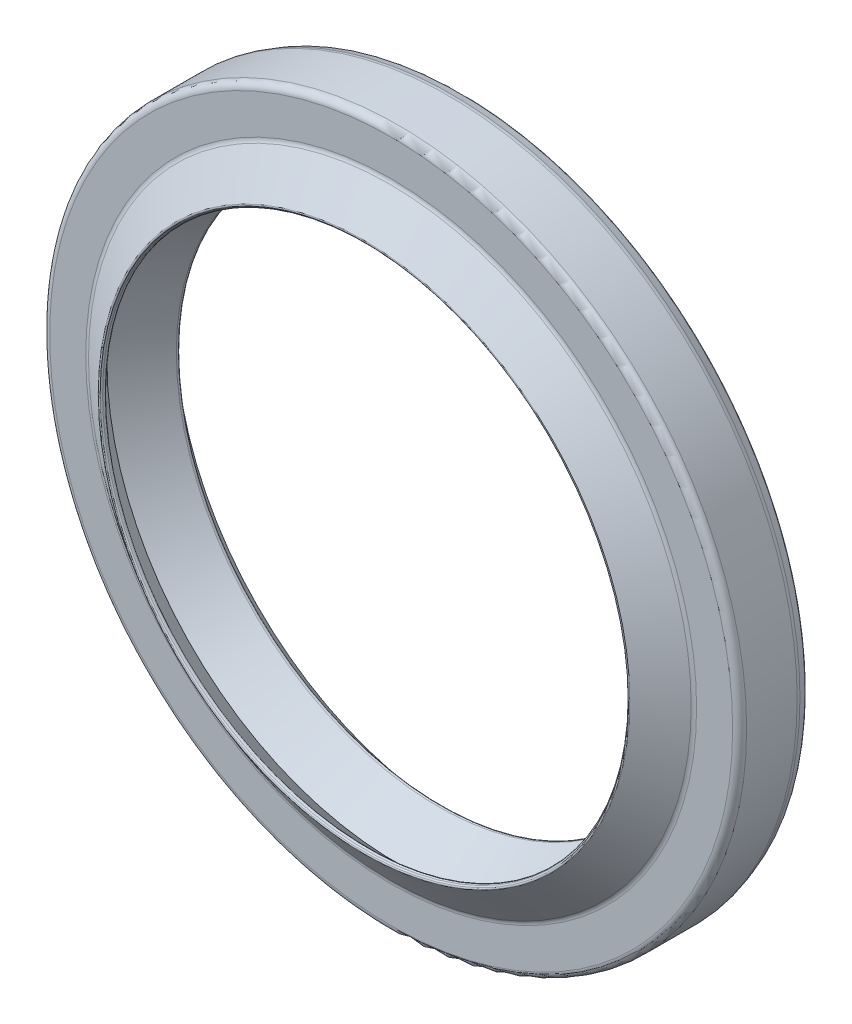
ISO-10303-21;
HEADER;
FILE_DESCRIPTION(('STEP AP214'),'2;1');
FILE_NAME('part.step','',(''),(''),'','','');
FILE_SCHEMA(('AUTOMOTIVE_DESIGN { 1 0 10303 214 1 1 1 1 }'));
ENDSEC;
DATA;
#1=APPLICATION_CONTEXT('core data for automotive mechanical design processes');
#2=APPLICATION_PROTOCOL_DEFINITION('international standard','automotive_design',2000,#1);
#3=PRODUCT_CONTEXT('',#1,'mechanical');
#4=PRODUCT('Part','Part','',(#3));
#5=PRODUCT_RELATED_PRODUCT_CATEGORY('part','',(#4));
#6=PRODUCT_DEFINITION_FORMATION('','',#4);
#7=PRODUCT_DEFINITION_CONTEXT('part definition',#1,'design');
#8=PRODUCT_DEFINITION('design','',#6,#7);
#9=PRODUCT_DEFINITION_SHAPE('','',#8);
#10=(LENGTH_UNIT() NAMED_UNIT(*) SI_UNIT(.MILLI.,.METRE.));
#11=(NAMED_UNIT(*) PLANE_ANGLE_UNIT() SI_UNIT($,.RADIAN.));
#12=(NAMED_UNIT(*) SI_UNIT($,.STERADIAN.) SOLID_ANGLE_UNIT());
#13=UNCERTAINTY_MEASURE_WITH_UNIT(LENGTH_MEASURE(1.E-05),#10,'distance_accuracy_value','');
#14=(GEOMETRIC_REPRESENTATION_CONTEXT(3) GLOBAL_UNCERTAINTY_ASSIGNED_CONTEXT((#13)) GLOBAL_UNIT_ASSIGNED_CONTEXT((#10,
#11,#12)) REPRESENTATION_CONTEXT('',''));
#15=CARTESIAN_POINT('',(0.,0.,0.));
#16=DIRECTION('',(0.,0.,1.));
#17=DIRECTION('',(1.,0.,0.));
#18=AXIS2_PLACEMENT_3D('',#15,#16,#17);
#19=CARTESIAN_POINT('',(0.,0.,1.));
#20=DIRECTION('',(0.,0.,1.));
#21=DIRECTION('',(1.,0.,0.));
#22=AXIS2_PLACEMENT_3D('',#19,#20,#21);
#23=TOROIDAL_SURFACE('',#22,42.5,0.750000000000002);
#24=CARTESIAN_POINT('',(43.25,0.,1.));
#25=VERTEX_POINT('',#24);
#26=VERTEX_LOOP('',#25);
#27=FACE_BOUND('',#26,.T.);
#28=ADVANCED_FACE('F47',(#27),#23,.T.);
#29=CLOSED_SHELL('',(#28));
#30=MANIFOLD_SOLID_BREP('B2',#29);
#31=CARTESIAN_POINT('',(0.,0.,0.));
#32=DIRECTION('',(0.,0.,-1.));
#33=DIRECTION('',(-1.,0.,0.));
#34=AXIS2_PLACEMENT_3D('',#31,#32,#33);
#35=CYLINDRICAL_SURFACE('',#34,42.5);
#36=CARTESIAN_POINT('',(0.,0.,6.7));
#37=DIRECTION('',(0.,0.,-1.));
#38=DIRECTION('',(-1.,0.,0.));
#39=AXIS2_PLACEMENT_3D('',#36,#37,#38);
#40=CIRCLE('',#39,42.5);
#41=CARTESIAN_POINT('',(-42.5,0.,6.7));
#42=VERTEX_POINT('',#41);
#43=EDGE_CURVE('E65',#42,#42,#40,.T.);
#44=ORIENTED_EDGE('',*,*,#43,.T.);
#45=EDGE_LOOP('',(#44));
#46=FACE_BOUND('',#45,.T.);
#47=CARTESIAN_POINT('',(0.,0.,1.75));
#48=DIRECTION('',(0.,0.,-1.));
#49=DIRECTION('',(-1.,0.,0.));
#50=AXIS2_PLACEMENT_3D('',#47,#48,#49);
#51=CIRCLE('',#50,42.5);
#52=CARTESIAN_POINT('',(-42.5,0.,1.75));
#53=VERTEX_POINT('',#52);
#54=EDGE_CURVE('E135',#53,#53,#51,.T.);
#55=ORIENTED_EDGE('',*,*,#54,.F.);
#56=EDGE_LOOP('',(#55));
#57=FACE_BOUND('',#56,.T.);
#58=ADVANCED_FACE('F58',(#46,#57),#35,.T.);
#59=CARTESIAN_POINT('',(0.,46.5,7.));
#60=DIRECTION('',(0.,0.,-1.));
#61=DIRECTION('',(-1.,0.,0.));
#62=AXIS2_PLACEMENT_3D('',#59,#60,#61);
#63=PLANE('',#62);
#64=CARTESIAN_POINT('',(0.,0.,7.));
#65=DIRECTION('',(0.,0.,-1.));
#66=DIRECTION('',(-1.,0.,0.));
#67=AXIS2_PLACEMENT_3D('',#64,#65,#66);
#68=CIRCLE('',#67,42.8);
#69=CARTESIAN_POINT('',(-42.8,0.,7.));
#70=VERTEX_POINT('',#69);
#71=EDGE_CURVE('E46',#70,#70,#68,.F.);
#72=ORIENTED_EDGE('',*,*,#71,.T.);
#73=EDGE_LOOP('',(#72));
#74=FACE_BOUND('',#73,.T.);
#75=CARTESIAN_POINT('',(0.,0.,7.));
#76=DIRECTION('',(0.,0.,-1.));
#77=DIRECTION('',(-1.,0.,0.));
#78=AXIS2_PLACEMENT_3D('',#75,#76,#77);
#79=CIRCLE('',#78,46.);
#80=CARTESIAN_POINT('',(-46.,0.,7.));
#81=VERTEX_POINT('',#80);
#82=EDGE_CURVE('E73',#81,#81,#79,.T.);
#83=ORIENTED_EDGE('',*,*,#82,.T.);
#84=EDGE_LOOP('',(#83));
#85=FACE_BOUND('',#84,.T.);
#86=ADVANCED_FACE('F143',(#74,#85),#63,.T.);
#87=CARTESIAN_POINT('',(0.,0.,0.));
#88=DIRECTION('',(0.,0.,-1.));
#89=DIRECTION('',(-1.,0.,0.));
#90=AXIS2_PLACEMENT_3D('',#87,#88,#89);
#91=CYLINDRICAL_SURFACE('',#90,46.5);
#92=CARTESIAN_POINT('',(0.,0.,6.5));
#93=DIRECTION('',(0.,0.,-1.));
#94=DIRECTION('',(-1.,0.,0.));
#95=AXIS2_PLACEMENT_3D('',#92,#93,#94);
#96=CIRCLE('',#95,46.5);
#97=CARTESIAN_POINT('',(-46.5,0.,6.5));
#98=VERTEX_POINT('',#97);
#99=EDGE_CURVE('E69',#98,#98,#96,.F.);
#100=ORIENTED_EDGE('',*,*,#99,.T.);
#101=EDGE_LOOP('',(#100));
#102=FACE_BOUND('',#101,.T.);
#103=CARTESIAN_POINT('',(0.,0.,0.3));
#104=DIRECTION('',(0.,0.,-1.));
#105=DIRECTION('',(-1.,0.,0.));
#106=AXIS2_PLACEMENT_3D('',#103,#104,#105);
#107=CIRCLE('',#106,46.5);
#108=CARTESIAN_POINT('',(-46.5,0.,0.3));
#109=VERTEX_POINT('',#108);
#110=EDGE_CURVE('E81',#109,#109,#107,.T.);
#111=ORIENTED_EDGE('',*,*,#110,.T.);
#112=EDGE_LOOP('',(#111));
#113=FACE_BOUND('',#112,.T.);
#114=ADVANCED_FACE('F149',(#102,#113),#91,.F.);
#115=CARTESIAN_POINT('',(0.,49.5,0.));
#116=DIRECTION('',(0.,0.,-1.));
#117=DIRECTION('',(-1.,0.,0.));
#118=AXIS2_PLACEMENT_3D('',#115,#116,#117);
#119=PLANE('',#118);
#120=CARTESIAN_POINT('',(0.,0.,0.));
#121=DIRECTION('',(0.,0.,-1.));
#122=DIRECTION('',(-1.,0.,0.));
#123=AXIS2_PLACEMENT_3D('',#120,#121,#122);
#124=CIRCLE('',#123,46.8);
#125=CARTESIAN_POINT('',(-46.8,0.,0.));
#126=VERTEX_POINT('',#125);
#127=EDGE_CURVE('E78',#126,#126,#124,.F.);
#128=ORIENTED_EDGE('',*,*,#127,.T.);
#129=EDGE_LOOP('',(#128));
#130=FACE_BOUND('',#129,.T.);
#131=CARTESIAN_POINT('',(0.,0.,0.));
#132=DIRECTION('',(0.,0.,-1.));
#133=DIRECTION('',(-1.,0.,0.));
#134=AXIS2_PLACEMENT_3D('',#131,#132,#133);
#135=CIRCLE('',#134,49.2837722339832);
#136=CARTESIAN_POINT('',(-49.2837722339832,0.,0.));
#137=VERTEX_POINT('',#136);
#138=EDGE_CURVE('E93',#137,#137,#135,.T.);
#139=ORIENTED_EDGE('',*,*,#138,.T.);
#140=EDGE_LOOP('',(#139));
#141=FACE_BOUND('',#140,.T.);
#142=ADVANCED_FACE('F189',(#130,#141),#119,.T.);
#143=CARTESIAN_POINT('',(0.,0.,0.));
#144=DIRECTION('',(0.,0.,1.));
#145=DIRECTION('',(1.,0.,0.));
#146=AXIS2_PLACEMENT_3D('',#143,#144,#145);
#147=CONICAL_SURFACE('',#146,49.5,0.321750554396642);
#148=CARTESIAN_POINT('',(0.,0.,1.26907484122732));
#149=DIRECTION('',(0.,0.,-1.));
#150=DIRECTION('',(-1.,0.,0.));
#151=AXIS2_PLACEMENT_3D('',#148,#149,#150);
#152=CIRCLE('',#151,49.9230249470758);
#153=CARTESIAN_POINT('',(-49.9230249470758,0.,1.26907484122732));
#154=VERTEX_POINT('',#153);
#155=EDGE_CURVE('E87',#154,#154,#152,.T.);
#156=ORIENTED_EDGE('',*,*,#155,.T.);
#157=EDGE_LOOP('',(#156));
#158=FACE_BOUND('',#157,.T.);
#159=CARTESIAN_POINT('',(0.,0.,0.205131670194952));
#160=DIRECTION('',(0.,0.,-1.));
#161=DIRECTION('',(-1.,0.,0.));
#162=AXIS2_PLACEMENT_3D('',#159,#160,#161);
#163=CIRCLE('',#162,49.5683772233983);
#164=CARTESIAN_POINT('',(-49.5683772233983,0.,0.205131670194952));
#165=VERTEX_POINT('',#164);
#166=EDGE_CURVE('E90',#165,#165,#163,.F.);
#167=ORIENTED_EDGE('',*,*,#166,.T.);
#168=EDGE_LOOP('',(#167));
#169=FACE_BOUND('',#168,.T.);
#170=ADVANCED_FACE('F195',(#158,#169),#147,.T.);
#171=CARTESIAN_POINT('',(0.,0.,0.));
#172=DIRECTION('',(0.,0.,-1.));
#173=DIRECTION('',(-1.,0.,0.));
#174=AXIS2_PLACEMENT_3D('',#171,#172,#173);
#175=CYLINDRICAL_SURFACE('',#174,50.);
#176=CARTESIAN_POINT('',(0.,0.,1.74341649025257));
#177=DIRECTION('',(0.,0.,1.));
#178=DIRECTION('',(1.,0.,0.));
#179=AXIS2_PLACEMENT_3D('',#176,#177,#178);
#180=CIRCLE('',#179,50.);
#181=CARTESIAN_POINT('',(50.,0.,1.74341649025257));
#182=VERTEX_POINT('',#181);
#183=EDGE_CURVE('E84',#182,#182,#180,.T.);
#184=ORIENTED_EDGE('',*,*,#183,.T.);
#185=EDGE_LOOP('',(#184));
#186=FACE_BOUND('',#185,.T.);
#187=CARTESIAN_POINT('',(0.,0.,9.));
#188=DIRECTION('',(0.,0.,1.));
#189=DIRECTION('',(1.,0.,0.));
#190=AXIS2_PLACEMENT_3D('',#187,#188,#189);
#191=CIRCLE('',#190,50.);
#192=CARTESIAN_POINT('',(50.,0.,9.));
#193=VERTEX_POINT('',#192);
#194=EDGE_CURVE('E99',#193,#193,#191,.F.);
#195=ORIENTED_EDGE('',*,*,#194,.T.);
#196=EDGE_LOOP('',(#195));
#197=FACE_BOUND('',#196,.T.);
#198=ADVANCED_FACE('F201',(#186,#197),#175,.T.);
#199=CARTESIAN_POINT('',(0.,43.5,10.));
#200=DIRECTION('',(0.,0.,1.));
#201=DIRECTION('',(1.,0.,0.));
#202=AXIS2_PLACEMENT_3D('',#199,#200,#201);
#203=PLANE('',#202);
#204=CARTESIAN_POINT('',(0.,0.,10.));
#205=DIRECTION('',(0.,0.,1.));
#206=DIRECTION('',(1.,0.,0.));
#207=AXIS2_PLACEMENT_3D('',#204,#205,#206);
#208=CIRCLE('',#207,49.);
#209=CARTESIAN_POINT('',(49.,0.,10.));
#210=VERTEX_POINT('',#209);
#211=EDGE_CURVE('E96',#210,#210,#208,.T.);
#212=ORIENTED_EDGE('',*,*,#211,.T.);
#213=EDGE_LOOP('',(#212));
#214=FACE_BOUND('',#213,.T.);
#215=CARTESIAN_POINT('',(0.,0.,10.));
#216=DIRECTION('',(0.,0.,1.));
#217=DIRECTION('',(1.,0.,0.));
#218=AXIS2_PLACEMENT_3D('',#215,#216,#217);
#219=CIRCLE('',#218,43.8251838135919);
#220=CARTESIAN_POINT('',(43.8251838135919,0.,10.));
#221=VERTEX_POINT('',#220);
#222=EDGE_CURVE('E111',#221,#221,#219,.F.);
#223=ORIENTED_EDGE('',*,*,#222,.T.);
#224=EDGE_LOOP('',(#223));
#225=FACE_BOUND('',#224,.T.);
#226=ADVANCED_FACE('F205',(#214,#225),#203,.T.);
#227=CARTESIAN_POINT('',(0.,0.,10.));
#228=DIRECTION('',(0.,0.,-1.));
#229=DIRECTION('',(-1.,0.,0.));
#230=AXIS2_PLACEMENT_3D('',#227,#228,#229);
#231=CONICAL_SURFACE('',#230,43.5,0.942000040379463);
#232=CARTESIAN_POINT('',(0.,0.,13.8994821746741));
#233=DIRECTION('',(0.,0.,1.));
#234=DIRECTION('',(1.,0.,0.));
#235=AXIS2_PLACEMENT_3D('',#232,#233,#234);
#236=CIRCLE('',#235,38.1382120098231);
#237=CARTESIAN_POINT('',(38.1382120098231,0.,13.8994821746741));
#238=VERTEX_POINT('',#237);
#239=EDGE_CURVE('E105',#238,#238,#236,.F.);
#240=ORIENTED_EDGE('',*,*,#239,.T.);
#241=EDGE_LOOP('',(#240));
#242=FACE_BOUND('',#241,.T.);
#243=CARTESIAN_POINT('',(0.,0.,10.1912639156968));
#244=DIRECTION('',(0.,0.,-1.));
#245=DIRECTION('',(-1.,0.,0.));
#246=AXIS2_PLACEMENT_3D('',#243,#244,#245);
#247=CIRCLE('',#246,43.2370121159169);
#248=CARTESIAN_POINT('',(-43.2370121159169,0.,10.1912639156968));
#249=VERTEX_POINT('',#248);
#250=EDGE_CURVE('E108',#249,#249,#247,.F.);
#251=ORIENTED_EDGE('',*,*,#250,.T.);
#252=EDGE_LOOP('',(#251));
#253=FACE_BOUND('',#252,.T.);
#254=ADVANCED_FACE('F209',(#242,#253),#231,.T.);
#255=CARTESIAN_POINT('',(0.,0.,14.));
#256=DIRECTION('',(0.,0.,1.));
#257=DIRECTION('',(1.,0.,0.));
#258=AXIS2_PLACEMENT_3D('',#255,#256,#257);
#259=CONICAL_SURFACE('',#258,38.,0.785398163397454);
#260=CARTESIAN_POINT('',(0.,0.,13.8791563140508));
#261=DIRECTION('',(0.,0.,-1.));
#262=DIRECTION('',(-1.,0.,0.));
#263=AXIS2_PLACEMENT_3D('',#260,#261,#262);
#264=CIRCLE('',#263,37.8791563140508);
#265=CARTESIAN_POINT('',(-37.8791563140508,0.,13.8791563140508));
#266=VERTEX_POINT('',#265);
#267=EDGE_CURVE('E102',#266,#266,#264,.F.);
#268=ORIENTED_EDGE('',*,*,#267,.T.);
#269=EDGE_LOOP('',(#268));
#270=FACE_BOUND('',#269,.T.);
#271=CARTESIAN_POINT('',(0.,0.,13.7066255079628));
#272=DIRECTION('',(0.,0.,-1.));
#273=DIRECTION('',(-1.,0.,0.));
#274=AXIS2_PLACEMENT_3D('',#271,#272,#273);
#275=CIRCLE('',#274,37.7066255079628);
#276=CARTESIAN_POINT('',(-37.7066255079628,0.,13.7066255079628));
#277=VERTEX_POINT('',#276);
#278=EDGE_CURVE('E114',#277,#277,#275,.T.);
#279=ORIENTED_EDGE('',*,*,#278,.T.);
#280=EDGE_LOOP('',(#279));
#281=FACE_BOUND('',#280,.T.);
#282=ADVANCED_FACE('F213',(#270,#281),#259,.F.);
#283=CARTESIAN_POINT('',(0.,0.,13.4944934736069));
#284=DIRECTION('',(0.,0.,-1.));
#285=DIRECTION('',(-1.,0.,0.));
#286=AXIS2_PLACEMENT_3D('',#283,#284,#285);
#287=TOROIDAL_SURFACE('',#286,37.9187575423188,0.300000000000006);
#288=CARTESIAN_POINT('',(0.,0.,13.2880127586934));
#289=DIRECTION('',(0.,0.,-1.));
#290=DIRECTION('',(-1.,0.,0.));
#291=AXIS2_PLACEMENT_3D('',#288,#289,#290);
#292=CIRCLE('',#291,37.7011208855515);
#293=CARTESIAN_POINT('',(-37.7011208855515,0.,13.2880127586934));
#294=VERTEX_POINT('',#293);
#295=EDGE_CURVE('E117',#294,#294,#292,.T.);
#296=ORIENTED_EDGE('',*,*,#295,.T.);
#297=EDGE_LOOP('',(#296));
#298=FACE_BOUND('',#297,.T.);
#299=ORIENTED_EDGE('',*,*,#278,.F.);
#300=EDGE_LOOP('',(#299));
#301=FACE_BOUND('',#300,.T.);
#302=ADVANCED_FACE('F217',(#298,#301),#287,.T.);
#303=CARTESIAN_POINT('',(0.,0.,13.2880127586934));
#304=DIRECTION('',(0.,0.,-1.));
#305=DIRECTION('',(-1.,0.,0.));
#306=AXIS2_PLACEMENT_3D('',#303,#304,#305);
#307=CONICAL_SURFACE('',#306,37.7011208855515,0.759100325224125);
#308=CARTESIAN_POINT('',(0.,0.,9.283884090899));
#309=DIRECTION('',(0.,0.,-1.));
#310=DIRECTION('',(-1.,0.,0.));
#311=AXIS2_PLACEMENT_3D('',#308,#309,#310);
#312=CIRCLE('',#311,41.5);
#313=CARTESIAN_POINT('',(-41.5,0.,9.283884090899));
#314=VERTEX_POINT('',#313);
#315=EDGE_CURVE('E120',#314,#314,#312,.T.);
#316=ORIENTED_EDGE('',*,*,#315,.T.);
#317=EDGE_LOOP('',(#316));
#318=FACE_BOUND('',#317,.T.);
#319=ORIENTED_EDGE('',*,*,#295,.F.);
#320=EDGE_LOOP('',(#319));
#321=FACE_BOUND('',#320,.T.);
#322=ADVANCED_FACE('F221',(#318,#321),#307,.F.);
#323=CARTESIAN_POINT('',(0.,0.,9.283884090899));
#324=DIRECTION('',(0.,0.,1.));
#325=DIRECTION('',(1.,0.,0.));
#326=AXIS2_PLACEMENT_3D('',#323,#324,#325);
#327=CONICAL_SURFACE('',#326,41.5,0.567212909200534);
#328=CARTESIAN_POINT('',(0.,0.,3.19957143130248));
#329=DIRECTION('',(0.,0.,-1.));
#330=DIRECTION('',(-1.,0.,0.));
#331=AXIS2_PLACEMENT_3D('',#328,#329,#330);
#332=CIRCLE('',#331,37.6240287007763);
#333=CARTESIAN_POINT('',(-37.6240287007763,0.,3.19957143130248));
#334=VERTEX_POINT('',#333);
#335=EDGE_CURVE('E123',#334,#334,#332,.T.);
#336=ORIENTED_EDGE('',*,*,#335,.T.);
#337=EDGE_LOOP('',(#336));
#338=FACE_BOUND('',#337,.T.);
#339=ORIENTED_EDGE('',*,*,#315,.F.);
#340=EDGE_LOOP('',(#339));
#341=FACE_BOUND('',#340,.T.);
#342=ADVANCED_FACE('F225',(#338,#341),#327,.F.);
#343=CARTESIAN_POINT('',(0.,0.,3.03838638087827));
#344=DIRECTION('',(0.,0.,-1.));
#345=DIRECTION('',(-1.,0.,0.));
#346=AXIS2_PLACEMENT_3D('',#343,#344,#345);
#347=TOROIDAL_SURFACE('',#346,37.8770492128296,0.300000000000004);
#348=CARTESIAN_POINT('',(0.,0.,2.80951305465175));
#349=DIRECTION('',(0.,0.,-1.));
#350=DIRECTION('',(-1.,0.,0.));
#351=AXIS2_PLACEMENT_3D('',#348,#349,#350);
#352=CIRCLE('',#351,37.6830981866864);
#353=CARTESIAN_POINT('',(-37.6830981866864,0.,2.80951305465175));
#354=VERTEX_POINT('',#353);
#355=EDGE_CURVE('E126',#354,#354,#352,.T.);
#356=ORIENTED_EDGE('',*,*,#355,.T.);
#357=EDGE_LOOP('',(#356));
#358=FACE_BOUND('',#357,.T.);
#359=ORIENTED_EDGE('',*,*,#335,.F.);
#360=EDGE_LOOP('',(#359));
#361=FACE_BOUND('',#360,.T.);
#362=ADVANCED_FACE('F229',(#358,#361),#347,.T.);
#363=CARTESIAN_POINT('',(0.,0.,2.80951305465175));
#364=DIRECTION('',(0.,0.,-1.));
#365=DIRECTION('',(-1.,0.,0.));
#366=AXIS2_PLACEMENT_3D('',#363,#364,#365);
#367=CONICAL_SURFACE('',#366,37.6830981866864,0.867804048431512);
#368=CARTESIAN_POINT('',(0.,0.,0.25));
#369=DIRECTION('',(0.,0.,-1.));
#370=DIRECTION('',(-1.,0.,0.));
#371=AXIS2_PLACEMENT_3D('',#368,#369,#370);
#372=CIRCLE('',#371,40.7034702774519);
#373=CARTESIAN_POINT('',(-40.7034702774519,0.,0.25));
#374=VERTEX_POINT('',#373);
#375=EDGE_CURVE('E129',#374,#374,#372,.T.);
#376=ORIENTED_EDGE('',*,*,#375,.T.);
#377=EDGE_LOOP('',(#376));
#378=FACE_BOUND('',#377,.T.);
#379=ORIENTED_EDGE('',*,*,#355,.F.);
#380=EDGE_LOOP('',(#379));
#381=FACE_BOUND('',#380,.T.);
#382=ADVANCED_FACE('F233',(#378,#381),#367,.F.);
#383=CARTESIAN_POINT('',(0.,42.5,0.250000000000001));
#384=DIRECTION('',(0.,0.,-1.));
#385=DIRECTION('',(-1.,0.,0.));
#386=AXIS2_PLACEMENT_3D('',#383,#384,#385);
#387=PLANE('',#386);
#388=CARTESIAN_POINT('',(0.,0.,0.250000000000001));
#389=DIRECTION('',(0.,0.,-1.));
#390=DIRECTION('',(-1.,0.,0.));
#391=AXIS2_PLACEMENT_3D('',#388,#389,#390);
#392=CIRCLE('',#391,42.5);
#393=CARTESIAN_POINT('',(-42.5,0.,0.250000000000001));
#394=VERTEX_POINT('',#393);
#395=EDGE_CURVE('E132',#394,#394,#392,.T.);
#396=ORIENTED_EDGE('',*,*,#395,.T.);
#397=EDGE_LOOP('',(#396));
#398=FACE_BOUND('',#397,.T.);
#399=ORIENTED_EDGE('',*,*,#375,.F.);
#400=EDGE_LOOP('',(#399));
#401=FACE_BOUND('',#400,.T.);
#402=ADVANCED_FACE('F237',(#398,#401),#387,.T.);
#403=CARTESIAN_POINT('',(0.,0.,1.));
#404=DIRECTION('',(0.,0.,-1.));
#405=DIRECTION('',(-1.,0.,0.));
#406=AXIS2_PLACEMENT_3D('',#403,#404,#405);
#407=TOROIDAL_SURFACE('',#406,42.5,0.75);
#408=ORIENTED_EDGE('',*,*,#54,.T.);
#409=EDGE_LOOP('',(#408));
#410=FACE_BOUND('',#409,.T.);
#411=ORIENTED_EDGE('',*,*,#395,.F.);
#412=EDGE_LOOP('',(#411));
#413=FACE_BOUND('',#412,.T.);
#414=ADVANCED_FACE('F139',(#410,#413),#407,.F.);
#415=CARTESIAN_POINT('',(0.,0.,11.));
#416=DIRECTION('',(0.,0.,1.));
#417=DIRECTION('',(1.,0.,0.));
#418=AXIS2_PLACEMENT_3D('',#415,#416,#417);
#419=TOROIDAL_SURFACE('',#418,43.8251838135919,1.);
#420=ORIENTED_EDGE('',*,*,#250,.F.);
#421=EDGE_LOOP('',(#420));
#422=FACE_BOUND('',#421,.T.);
#423=ORIENTED_EDGE('',*,*,#222,.F.);
#424=EDGE_LOOP('',(#423));
#425=FACE_BOUND('',#424,.T.);
#426=ADVANCED_FACE('F153',(#422,#425),#419,.F.);
#427=CARTESIAN_POINT('',(0.,0.,13.7377349578135));
#428=DIRECTION('',(0.,0.,1.));
#429=DIRECTION('',(1.,0.,0.));
#430=AXIS2_PLACEMENT_3D('',#427,#428,#429);
#431=TOROIDAL_SURFACE('',#430,38.0205776702881,0.2);
#432=ORIENTED_EDGE('',*,*,#267,.F.);
#433=EDGE_LOOP('',(#432));
#434=FACE_BOUND('',#433,.T.);
#435=ORIENTED_EDGE('',*,*,#239,.F.);
#436=EDGE_LOOP('',(#435));
#437=FACE_BOUND('',#436,.T.);
#438=ADVANCED_FACE('F156',(#434,#437),#431,.T.);
#439=CARTESIAN_POINT('',(0.,0.,9.));
#440=DIRECTION('',(0.,0.,1.));
#441=DIRECTION('',(1.,0.,0.));
#442=AXIS2_PLACEMENT_3D('',#439,#440,#441);
#443=TOROIDAL_SURFACE('',#442,49.,1.);
#444=ORIENTED_EDGE('',*,*,#211,.F.);
#445=EDGE_LOOP('',(#444));
#446=FACE_BOUND('',#445,.T.);
#447=ORIENTED_EDGE('',*,*,#194,.F.);
#448=EDGE_LOOP('',(#447));
#449=FACE_BOUND('',#448,.T.);
#450=ADVANCED_FACE('F160',(#446,#449),#443,.T.);
#451=CARTESIAN_POINT('',(0.,0.,0.3));
#452=DIRECTION('',(0.,0.,-1.));
#453=DIRECTION('',(-1.,0.,0.));
#454=AXIS2_PLACEMENT_3D('',#451,#452,#453);
#455=TOROIDAL_SURFACE('',#454,49.2837722339832,0.3);
#456=ORIENTED_EDGE('',*,*,#166,.F.);
#457=EDGE_LOOP('',(#456));
#458=FACE_BOUND('',#457,.T.);
#459=ORIENTED_EDGE('',*,*,#138,.F.);
#460=EDGE_LOOP('',(#459));
#461=FACE_BOUND('',#460,.T.);
#462=ADVANCED_FACE('F164',(#458,#461),#455,.T.);
#463=CARTESIAN_POINT('',(0.,0.,1.74341649025257));
#464=DIRECTION('',(0.,0.,1.));
#465=DIRECTION('',(1.,0.,0.));
#466=AXIS2_PLACEMENT_3D('',#463,#464,#465);
#467=TOROIDAL_SURFACE('',#466,48.5,1.5);
#468=ORIENTED_EDGE('',*,*,#183,.F.);
#469=EDGE_LOOP('',(#468));
#470=FACE_BOUND('',#469,.T.);
#471=ORIENTED_EDGE('',*,*,#155,.F.);
#472=EDGE_LOOP('',(#471));
#473=FACE_BOUND('',#472,.T.);
#474=ADVANCED_FACE('F168',(#470,#473),#467,.T.);
#475=CARTESIAN_POINT('',(0.,0.,0.3));
#476=DIRECTION('',(0.,0.,-1.));
#477=DIRECTION('',(-1.,0.,0.));
#478=AXIS2_PLACEMENT_3D('',#475,#476,#477);
#479=TOROIDAL_SURFACE('',#478,46.8,0.3);
#480=ORIENTED_EDGE('',*,*,#127,.F.);
#481=EDGE_LOOP('',(#480));
#482=FACE_BOUND('',#481,.T.);
#483=ORIENTED_EDGE('',*,*,#110,.F.);
#484=EDGE_LOOP('',(#483));
#485=FACE_BOUND('',#484,.T.);
#486=ADVANCED_FACE('F172',(#482,#485),#479,.T.);
#487=CARTESIAN_POINT('',(0.,0.,6.5));
#488=DIRECTION('',(0.,0.,-1.));
#489=DIRECTION('',(-1.,0.,0.));
#490=AXIS2_PLACEMENT_3D('',#487,#488,#489);
#491=TOROIDAL_SURFACE('',#490,46.,0.5);
#492=ORIENTED_EDGE('',*,*,#99,.F.);
#493=EDGE_LOOP('',(#492));
#494=FACE_BOUND('',#493,.T.);
#495=ORIENTED_EDGE('',*,*,#82,.F.);
#496=EDGE_LOOP('',(#495));
#497=FACE_BOUND('',#496,.T.);
#498=ADVANCED_FACE('F175',(#494,#497),#491,.F.);
#499=CARTESIAN_POINT('',(0.,0.,6.7));
#500=DIRECTION('',(0.,0.,-1.));
#501=DIRECTION('',(-1.,0.,0.));
#502=AXIS2_PLACEMENT_3D('',#499,#500,#501);
#503=TOROIDAL_SURFACE('',#502,42.8,0.3);
#504=ORIENTED_EDGE('',*,*,#71,.F.);
#505=EDGE_LOOP('',(#504));
#506=FACE_BOUND('',#505,.T.);
#507=ORIENTED_EDGE('',*,*,#43,.F.);
#508=EDGE_LOOP('',(#507));
#509=FACE_BOUND('',#508,.T.);
#510=ADVANCED_FACE('F60',(#506,#509),#503,.F.);
#511=CLOSED_SHELL('',(#58,#86,#114,#142,#170,#198,#226,#254,#282,#302,#322,#342,#362,#382,#402,
#414,#426,#438,#450,#462,#474,#486,#498,#510));
#512=MANIFOLD_SOLID_BREP('B6',#511);
#513=ADVANCED_BREP_SHAPE_REPRESENTATION('',(#18,#30,#512),#14);
#514=SHAPE_DEFINITION_REPRESENTATION(#9,#513);
ENDSEC;
END-ISO-10303-21;
